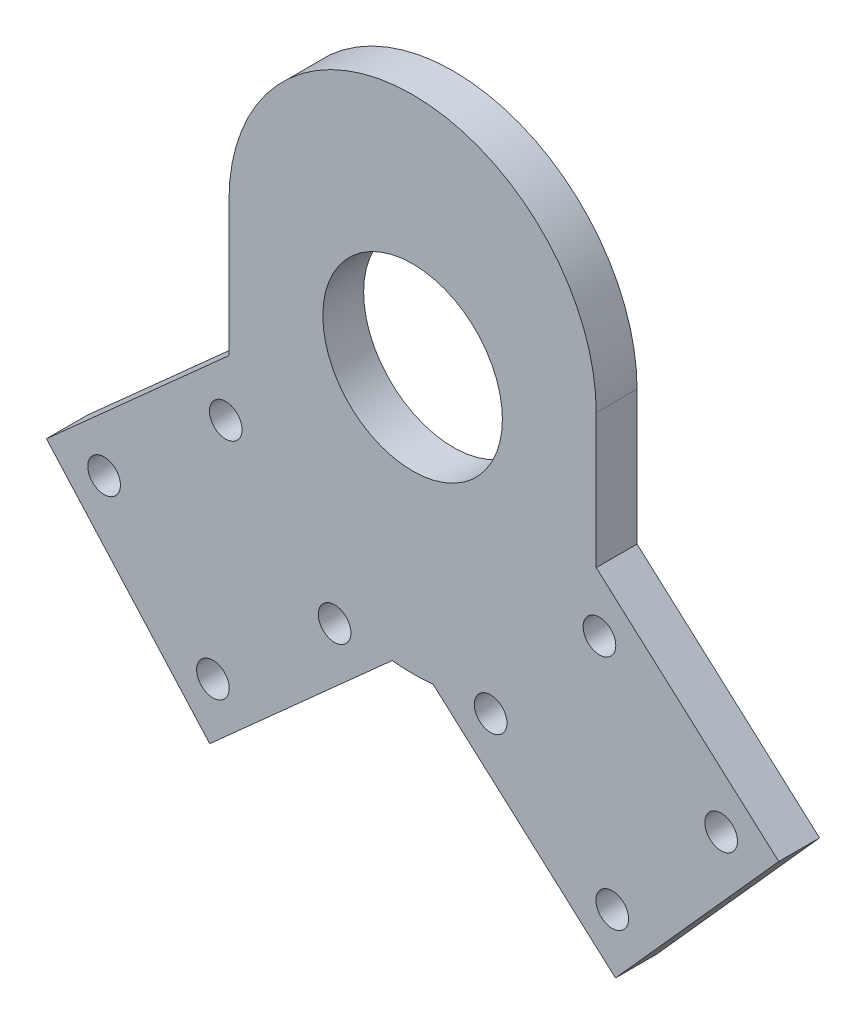
ISO-10303-21;
HEADER;
FILE_DESCRIPTION(('STEP AP214'),'2;1');
FILE_NAME('part.step','',(''),(''),'','','');
FILE_SCHEMA(('AUTOMOTIVE_DESIGN { 1 0 10303 214 1 1 1 1 }'));
ENDSEC;
DATA;
#1=APPLICATION_CONTEXT('core data for automotive mechanical design processes');
#2=APPLICATION_PROTOCOL_DEFINITION('international standard','automotive_design',2000,#1);
#3=PRODUCT_CONTEXT('',#1,'mechanical');
#4=PRODUCT('Part','Part','',(#3));
#5=PRODUCT_RELATED_PRODUCT_CATEGORY('part','',(#4));
#6=PRODUCT_DEFINITION_FORMATION('','',#4);
#7=PRODUCT_DEFINITION_CONTEXT('part definition',#1,'design');
#8=PRODUCT_DEFINITION('design','',#6,#7);
#9=PRODUCT_DEFINITION_SHAPE('','',#8);
#10=(LENGTH_UNIT() NAMED_UNIT(*) SI_UNIT(.MILLI.,.METRE.));
#11=(NAMED_UNIT(*) PLANE_ANGLE_UNIT() SI_UNIT($,.RADIAN.));
#12=(NAMED_UNIT(*) SI_UNIT($,.STERADIAN.) SOLID_ANGLE_UNIT());
#13=UNCERTAINTY_MEASURE_WITH_UNIT(LENGTH_MEASURE(1.E-05),#10,'distance_accuracy_value','');
#14=(GEOMETRIC_REPRESENTATION_CONTEXT(3) GLOBAL_UNCERTAINTY_ASSIGNED_CONTEXT((#13)) GLOBAL_UNIT_ASSIGNED_CONTEXT((#10,
#11,#12)) REPRESENTATION_CONTEXT('',''));
#15=CARTESIAN_POINT('',(0.,0.,0.));
#16=DIRECTION('',(0.,0.,1.));
#17=DIRECTION('',(1.,0.,0.));
#18=AXIS2_PLACEMENT_3D('',#15,#16,#17);
#19=CARTESIAN_POINT('',(-44.8606797749979,-20.,5.));
#20=DIRECTION('',(0.74535599249993,0.666666666666667,0.));
#21=DIRECTION('',(-0.666666666666667,0.74535599249993,0.));
#22=AXIS2_PLACEMENT_3D('',#19,#20,#21);
#23=PLANE('',#22);
#24=DIRECTION('',(0.666666666666667,-0.74535599249993,0.));
#25=VECTOR('',#24,1.);
#26=CARTESIAN_POINT('',(-44.8606797749979,-20.,0.));
#27=LINE('',#26,#25);
#28=CARTESIAN_POINT('',(-44.8606797749979,-20.,0.));
#29=VERTEX_POINT('',#28);
#30=CARTESIAN_POINT('',(-24.8606797749979,-42.3606797749979,0.));
#31=VERTEX_POINT('',#30);
#32=EDGE_CURVE('E266',#29,#31,#27,.T.);
#33=ORIENTED_EDGE('',*,*,#32,.T.);
#34=DIRECTION('',(0.,0.,-1.));
#35=VECTOR('',#34,1.);
#36=CARTESIAN_POINT('',(-24.8606797749979,-42.3606797749979,5.));
#37=LINE('',#36,#35);
#38=CARTESIAN_POINT('',(-24.8606797749979,-42.3606797749979,5.));
#39=VERTEX_POINT('',#38);
#40=EDGE_CURVE('E286',#39,#31,#37,.T.);
#41=ORIENTED_EDGE('',*,*,#40,.F.);
#42=DIRECTION('',(0.666666666666667,-0.74535599249993,0.));
#43=VECTOR('',#42,1.);
#44=CARTESIAN_POINT('',(-44.8606797749979,-20.,5.));
#45=LINE('',#44,#43);
#46=CARTESIAN_POINT('',(-44.8606797749979,-20.,5.));
#47=VERTEX_POINT('',#46);
#48=EDGE_CURVE('E275',#47,#39,#45,.T.);
#49=ORIENTED_EDGE('',*,*,#48,.F.);
#50=DIRECTION('',(0.,0.,-1.));
#51=VECTOR('',#50,1.);
#52=CARTESIAN_POINT('',(-44.8606797749979,-20.,5.));
#53=LINE('',#52,#51);
#54=EDGE_CURVE('E283',#47,#29,#53,.T.);
#55=ORIENTED_EDGE('',*,*,#54,.T.);
#56=EDGE_LOOP('',(#33,#41,#49,#55));
#57=FACE_BOUND('',#56,.T.);
#58=ADVANCED_FACE('F141',(#57),#23,.F.);
#59=CARTESIAN_POINT('',(-2.5,-22.3606797749979,5.));
#60=DIRECTION('',(0.666666666666667,-0.74535599249993,0.));
#61=DIRECTION('',(0.74535599249993,0.666666666666667,0.));
#62=AXIS2_PLACEMENT_3D('',#59,#60,#61);
#63=PLANE('',#62);
#64=DIRECTION('',(-0.74535599249993,-0.666666666666667,0.));
#65=VECTOR('',#64,1.);
#66=CARTESIAN_POINT('',(-2.5,-22.3606797749979,0.));
#67=LINE('',#66,#65);
#68=CARTESIAN_POINT('',(-2.5,-22.3606797749979,0.));
#69=VERTEX_POINT('',#68);
#70=EDGE_CURVE('E277',#69,#31,#67,.T.);
#71=ORIENTED_EDGE('',*,*,#70,.F.);
#72=DIRECTION('',(0.,0.,-1.));
#73=VECTOR('',#72,1.);
#74=CARTESIAN_POINT('',(-2.5,-22.3606797749979,5.));
#75=LINE('',#74,#73);
#76=CARTESIAN_POINT('',(-2.5,-22.3606797749979,5.));
#77=VERTEX_POINT('',#76);
#78=EDGE_CURVE('E12',#77,#69,#75,.T.);
#79=ORIENTED_EDGE('',*,*,#78,.F.);
#80=DIRECTION('',(-0.74535599249993,-0.666666666666667,0.));
#81=VECTOR('',#80,1.);
#82=CARTESIAN_POINT('',(-2.5,-22.3606797749979,5.));
#83=LINE('',#82,#81);
#84=EDGE_CURVE('E271',#77,#39,#83,.T.);
#85=ORIENTED_EDGE('',*,*,#84,.T.);
#86=ORIENTED_EDGE('',*,*,#40,.T.);
#87=EDGE_LOOP('',(#71,#79,#85,#86));
#88=FACE_BOUND('',#87,.T.);
#89=ADVANCED_FACE('F359',(#88),#63,.T.);
#90=CARTESIAN_POINT('',(-22.5,0.,5.));
#91=DIRECTION('',(0.666666666666667,-0.74535599249993,0.));
#92=DIRECTION('',(0.74535599249993,0.666666666666667,0.));
#93=AXIS2_PLACEMENT_3D('',#90,#91,#92);
#94=PLANE('',#93);
#95=DIRECTION('',(-0.74535599249993,-0.666666666666667,0.));
#96=VECTOR('',#95,1.);
#97=CARTESIAN_POINT('',(-22.5,0.,0.));
#98=LINE('',#97,#96);
#99=CARTESIAN_POINT('',(-22.5,0.,0.));
#100=VERTEX_POINT('',#99);
#101=EDGE_CURVE('E262',#100,#29,#98,.T.);
#102=ORIENTED_EDGE('',*,*,#101,.T.);
#103=ORIENTED_EDGE('',*,*,#54,.F.);
#104=DIRECTION('',(-0.74535599249993,-0.666666666666667,0.));
#105=VECTOR('',#104,1.);
#106=CARTESIAN_POINT('',(-22.5,0.,5.));
#107=LINE('',#106,#105);
#108=CARTESIAN_POINT('',(-22.5,0.,5.));
#109=VERTEX_POINT('',#108);
#110=EDGE_CURVE('E289',#109,#47,#107,.T.);
#111=ORIENTED_EDGE('',*,*,#110,.F.);
#112=DIRECTION('',(0.,0.,-1.));
#113=VECTOR('',#112,1.);
#114=CARTESIAN_POINT('',(-22.5,0.,5.));
#115=LINE('',#114,#113);
#116=EDGE_CURVE('E152',#109,#100,#115,.T.);
#117=ORIENTED_EDGE('',*,*,#116,.T.);
#118=EDGE_LOOP('',(#102,#103,#111,#117));
#119=FACE_BOUND('',#118,.T.);
#120=ADVANCED_FACE('F365',(#119),#94,.F.);
#121=CARTESIAN_POINT('',(0.,0.,0.));
#122=DIRECTION('',(0.,0.,1.));
#123=DIRECTION('',(1.,0.,0.));
#124=AXIS2_PLACEMENT_3D('',#121,#122,#123);
#125=PLANE('',#124);
#126=CARTESIAN_POINT('',(0.,10.,0.));
#127=DIRECTION('',(0.,0.,-1.));
#128=DIRECTION('',(-1.,0.,0.));
#129=AXIS2_PLACEMENT_3D('',#126,#127,#128);
#130=CIRCLE('',#129,11.);
#131=CARTESIAN_POINT('',(-11.,10.,0.));
#132=VERTEX_POINT('',#131);
#133=EDGE_CURVE('E539',#132,#132,#130,.T.);
#134=ORIENTED_EDGE('',*,*,#133,.F.);
#135=EDGE_LOOP('',(#134));
#136=FACE_BOUND('',#135,.T.);
#137=CARTESIAN_POINT('',(-24.4672331458316,-35.3005664791649,0.));
#138=DIRECTION('',(0.,0.,1.));
#139=DIRECTION('',(1.,0.,0.));
#140=AXIS2_PLACEMENT_3D('',#137,#138,#139);
#141=CIRCLE('',#140,2.);
#142=CARTESIAN_POINT('',(-22.4672331458316,-35.3005664791649,0.));
#143=VERTEX_POINT('',#142);
#144=EDGE_CURVE('E594',#143,#143,#141,.T.);
#145=ORIENTED_EDGE('',*,*,#144,.T.);
#146=EDGE_LOOP('',(#145));
#147=FACE_BOUND('',#146,.T.);
#148=CARTESIAN_POINT('',(-37.8005664791649,-20.3934466291663,0.));
#149=DIRECTION('',(0.,0.,1.));
#150=DIRECTION('',(1.,0.,0.));
#151=AXIS2_PLACEMENT_3D('',#148,#149,#150);
#152=CIRCLE('',#151,2.);
#153=CARTESIAN_POINT('',(-35.8005664791649,-20.3934466291663,0.));
#154=VERTEX_POINT('',#153);
#155=EDGE_CURVE('E586',#154,#154,#152,.T.);
#156=ORIENTED_EDGE('',*,*,#155,.T.);
#157=EDGE_LOOP('',(#156));
#158=FACE_BOUND('',#157,.T.);
#159=CARTESIAN_POINT('',(-22.8934466291663,-7.06011329583298,0.));
#160=DIRECTION('',(0.,0.,1.));
#161=DIRECTION('',(1.,0.,0.));
#162=AXIS2_PLACEMENT_3D('',#159,#160,#161);
#163=CIRCLE('',#162,2.);
#164=CARTESIAN_POINT('',(-20.8934466291663,-7.06011329583298,0.));
#165=VERTEX_POINT('',#164);
#166=EDGE_CURVE('E578',#165,#165,#163,.T.);
#167=ORIENTED_EDGE('',*,*,#166,.T.);
#168=EDGE_LOOP('',(#167));
#169=FACE_BOUND('',#168,.T.);
#170=CARTESIAN_POINT('',(-9.56011329583299,-21.9672331458316,0.));
#171=DIRECTION('',(0.,0.,1.));
#172=DIRECTION('',(1.,0.,0.));
#173=AXIS2_PLACEMENT_3D('',#170,#171,#172);
#174=CIRCLE('',#173,2.);
#175=CARTESIAN_POINT('',(-7.56011329583299,-21.9672331458316,0.));
#176=VERTEX_POINT('',#175);
#177=EDGE_CURVE('E570',#176,#176,#174,.T.);
#178=ORIENTED_EDGE('',*,*,#177,.T.);
#179=EDGE_LOOP('',(#178));
#180=FACE_BOUND('',#179,.T.);
#181=CARTESIAN_POINT('',(9.56011329583297,-21.9672331458316,0.));
#182=DIRECTION('',(0.,0.,1.));
#183=DIRECTION('',(1.,0.,0.));
#184=AXIS2_PLACEMENT_3D('',#181,#182,#183);
#185=CIRCLE('',#184,2.);
#186=CARTESIAN_POINT('',(11.560113295833,-21.9672331458316,0.));
#187=VERTEX_POINT('',#186);
#188=EDGE_CURVE('E562',#187,#187,#185,.T.);
#189=ORIENTED_EDGE('',*,*,#188,.T.);
#190=EDGE_LOOP('',(#189));
#191=FACE_BOUND('',#190,.T.);
#192=CARTESIAN_POINT('',(24.4672331458316,-35.3005664791649,0.));
#193=DIRECTION('',(0.,0.,1.));
#194=DIRECTION('',(1.,0.,0.));
#195=AXIS2_PLACEMENT_3D('',#192,#193,#194);
#196=CIRCLE('',#195,2.);
#197=CARTESIAN_POINT('',(26.4672331458316,-35.3005664791649,0.));
#198=VERTEX_POINT('',#197);
#199=EDGE_CURVE('E554',#198,#198,#196,.T.);
#200=ORIENTED_EDGE('',*,*,#199,.T.);
#201=EDGE_LOOP('',(#200));
#202=FACE_BOUND('',#201,.T.);
#203=CARTESIAN_POINT('',(37.8005664791649,-20.3934466291663,0.));
#204=DIRECTION('',(0.,0.,1.));
#205=DIRECTION('',(1.,0.,0.));
#206=AXIS2_PLACEMENT_3D('',#203,#204,#205);
#207=CIRCLE('',#206,2.);
#208=CARTESIAN_POINT('',(39.8005664791649,-20.3934466291663,0.));
#209=VERTEX_POINT('',#208);
#210=EDGE_CURVE('E545',#209,#209,#207,.T.);
#211=ORIENTED_EDGE('',*,*,#210,.T.);
#212=EDGE_LOOP('',(#211));
#213=FACE_BOUND('',#212,.T.);
#214=CARTESIAN_POINT('',(22.8934466291663,-7.06011329583298,0.));
#215=DIRECTION('',(0.,0.,1.));
#216=DIRECTION('',(1.,0.,0.));
#217=AXIS2_PLACEMENT_3D('',#214,#215,#216);
#218=CIRCLE('',#217,2.);
#219=CARTESIAN_POINT('',(24.8934466291663,-7.06011329583298,0.));
#220=VERTEX_POINT('',#219);
#221=EDGE_CURVE('E549',#220,#220,#218,.T.);
#222=ORIENTED_EDGE('',*,*,#221,.T.);
#223=EDGE_LOOP('',(#222));
#224=FACE_BOUND('',#223,.T.);
#225=CARTESIAN_POINT('',(0.,16.4440290583573,0.));
#226=DIRECTION('',(0.,0.,1.));
#227=DIRECTION('',(1.,0.,0.));
#228=AXIS2_PLACEMENT_3D('',#225,#226,#227);
#229=CIRCLE('',#228,22.5);
#230=CARTESIAN_POINT('',(22.5,16.4440290583573,0.));
#231=VERTEX_POINT('',#230);
#232=CARTESIAN_POINT('',(-22.5,16.4440290583573,0.));
#233=VERTEX_POINT('',#232);
#234=EDGE_CURVE('E224',#231,#233,#229,.T.);
#235=ORIENTED_EDGE('',*,*,#234,.F.);
#236=DIRECTION('',(0.,-1.,0.));
#237=VECTOR('',#236,1.);
#238=CARTESIAN_POINT('',(22.5,16.4440290583573,0.));
#239=LINE('',#238,#237);
#240=CARTESIAN_POINT('',(22.5,0.,0.));
#241=VERTEX_POINT('',#240);
#242=EDGE_CURVE('E254',#231,#241,#239,.T.);
#243=ORIENTED_EDGE('',*,*,#242,.T.);
#244=DIRECTION('',(0.74535599249993,-0.666666666666667,0.));
#245=VECTOR('',#244,1.);
#246=CARTESIAN_POINT('',(22.5,0.,0.));
#247=LINE('',#246,#245);
#248=CARTESIAN_POINT('',(44.8606797749979,-20.,0.));
#249=VERTEX_POINT('',#248);
#250=EDGE_CURVE('E302',#241,#249,#247,.T.);
#251=ORIENTED_EDGE('',*,*,#250,.T.);
#252=DIRECTION('',(0.666666666666667,0.74535599249993,0.));
#253=VECTOR('',#252,1.);
#254=CARTESIAN_POINT('',(24.8606797749979,-42.3606797749979,0.));
#255=LINE('',#254,#253);
#256=CARTESIAN_POINT('',(24.8606797749979,-42.3606797749979,0.));
#257=VERTEX_POINT('',#256);
#258=EDGE_CURVE('E306',#257,#249,#255,.T.);
#259=ORIENTED_EDGE('',*,*,#258,.F.);
#260=DIRECTION('',(0.74535599249993,-0.666666666666667,0.));
#261=VECTOR('',#260,1.);
#262=CARTESIAN_POINT('',(2.49999999999999,-22.3606797749979,0.));
#263=LINE('',#262,#261);
#264=CARTESIAN_POINT('',(2.49999999999999,-22.3606797749979,0.));
#265=VERTEX_POINT('',#264);
#266=EDGE_CURVE('E295',#265,#257,#263,.T.);
#267=ORIENTED_EDGE('',*,*,#266,.F.);
#268=CARTESIAN_POINT('',(0.,0.,0.));
#269=DIRECTION('',(0.,0.,1.));
#270=DIRECTION('',(1.,0.,0.));
#271=AXIS2_PLACEMENT_3D('',#268,#269,#270);
#272=CIRCLE('',#271,22.5);
#273=EDGE_CURVE('E246',#69,#265,#272,.T.);
#274=ORIENTED_EDGE('',*,*,#273,.F.);
#275=ORIENTED_EDGE('',*,*,#70,.T.);
#276=ORIENTED_EDGE('',*,*,#32,.F.);
#277=ORIENTED_EDGE('',*,*,#101,.F.);
#278=DIRECTION('',(0.,-1.,0.));
#279=VECTOR('',#278,1.);
#280=CARTESIAN_POINT('',(-22.5,16.4440290583573,0.));
#281=LINE('',#280,#279);
#282=EDGE_CURVE('E252',#233,#100,#281,.T.);
#283=ORIENTED_EDGE('',*,*,#282,.F.);
#284=EDGE_LOOP('',(#235,#243,#251,#259,#267,#274,#275,#276,#277,#283));
#285=FACE_BOUND('',#284,.T.);
#286=ADVANCED_FACE('F263',(#136,#147,#158,#169,#180,#191,#202,#213,#224,#285),#125,.F.);
#287=CARTESIAN_POINT('',(0.,0.,5.));
#288=DIRECTION('',(0.,0.,1.));
#289=DIRECTION('',(1.,0.,0.));
#290=AXIS2_PLACEMENT_3D('',#287,#288,#289);
#291=PLANE('',#290);
#292=CARTESIAN_POINT('',(0.,10.,5.));
#293=DIRECTION('',(0.,0.,1.));
#294=DIRECTION('',(1.,0.,0.));
#295=AXIS2_PLACEMENT_3D('',#292,#293,#294);
#296=CIRCLE('',#295,11.);
#297=CARTESIAN_POINT('',(11.,10.,5.));
#298=VERTEX_POINT('',#297);
#299=EDGE_CURVE('E145',#298,#298,#296,.T.);
#300=ORIENTED_EDGE('',*,*,#299,.F.);
#301=EDGE_LOOP('',(#300));
#302=FACE_BOUND('',#301,.T.);
#303=CARTESIAN_POINT('',(-24.4672331458316,-35.3005664791649,5.));
#304=DIRECTION('',(0.,0.,1.));
#305=DIRECTION('',(1.,0.,0.));
#306=AXIS2_PLACEMENT_3D('',#303,#304,#305);
#307=CIRCLE('',#306,2.);
#308=CARTESIAN_POINT('',(-22.4672331458316,-35.3005664791649,5.));
#309=VERTEX_POINT('',#308);
#310=EDGE_CURVE('E543',#309,#309,#307,.T.);
#311=ORIENTED_EDGE('',*,*,#310,.F.);
#312=EDGE_LOOP('',(#311));
#313=FACE_BOUND('',#312,.T.);
#314=CARTESIAN_POINT('',(-37.8005664791649,-20.3934466291663,5.));
#315=DIRECTION('',(0.,0.,1.));
#316=DIRECTION('',(1.,0.,0.));
#317=AXIS2_PLACEMENT_3D('',#314,#315,#316);
#318=CIRCLE('',#317,2.);
#319=CARTESIAN_POINT('',(-35.8005664791649,-20.3934466291663,5.));
#320=VERTEX_POINT('',#319);
#321=EDGE_CURVE('E590',#320,#320,#318,.T.);
#322=ORIENTED_EDGE('',*,*,#321,.F.);
#323=EDGE_LOOP('',(#322));
#324=FACE_BOUND('',#323,.T.);
#325=CARTESIAN_POINT('',(-22.8934466291663,-7.06011329583298,5.));
#326=DIRECTION('',(0.,0.,1.));
#327=DIRECTION('',(1.,0.,0.));
#328=AXIS2_PLACEMENT_3D('',#325,#326,#327);
#329=CIRCLE('',#328,2.);
#330=CARTESIAN_POINT('',(-20.8934466291663,-7.06011329583298,5.));
#331=VERTEX_POINT('',#330);
#332=EDGE_CURVE('E582',#331,#331,#329,.T.);
#333=ORIENTED_EDGE('',*,*,#332,.F.);
#334=EDGE_LOOP('',(#333));
#335=FACE_BOUND('',#334,.T.);
#336=CARTESIAN_POINT('',(-9.56011329583299,-21.9672331458316,5.));
#337=DIRECTION('',(0.,0.,1.));
#338=DIRECTION('',(1.,0.,0.));
#339=AXIS2_PLACEMENT_3D('',#336,#337,#338);
#340=CIRCLE('',#339,2.);
#341=CARTESIAN_POINT('',(-7.56011329583299,-21.9672331458316,5.));
#342=VERTEX_POINT('',#341);
#343=EDGE_CURVE('E574',#342,#342,#340,.T.);
#344=ORIENTED_EDGE('',*,*,#343,.F.);
#345=EDGE_LOOP('',(#344));
#346=FACE_BOUND('',#345,.T.);
#347=CARTESIAN_POINT('',(9.56011329583297,-21.9672331458316,5.));
#348=DIRECTION('',(0.,0.,1.));
#349=DIRECTION('',(1.,0.,0.));
#350=AXIS2_PLACEMENT_3D('',#347,#348,#349);
#351=CIRCLE('',#350,2.);
#352=CARTESIAN_POINT('',(11.560113295833,-21.9672331458316,5.));
#353=VERTEX_POINT('',#352);
#354=EDGE_CURVE('E566',#353,#353,#351,.T.);
#355=ORIENTED_EDGE('',*,*,#354,.F.);
#356=EDGE_LOOP('',(#355));
#357=FACE_BOUND('',#356,.T.);
#358=CARTESIAN_POINT('',(24.4672331458316,-35.3005664791649,5.));
#359=DIRECTION('',(0.,0.,1.));
#360=DIRECTION('',(1.,0.,0.));
#361=AXIS2_PLACEMENT_3D('',#358,#359,#360);
#362=CIRCLE('',#361,2.);
#363=CARTESIAN_POINT('',(26.4672331458316,-35.3005664791649,5.));
#364=VERTEX_POINT('',#363);
#365=EDGE_CURVE('E558',#364,#364,#362,.T.);
#366=ORIENTED_EDGE('',*,*,#365,.F.);
#367=EDGE_LOOP('',(#366));
#368=FACE_BOUND('',#367,.T.);
#369=CARTESIAN_POINT('',(37.8005664791649,-20.3934466291663,5.));
#370=DIRECTION('',(0.,0.,1.));
#371=DIRECTION('',(1.,0.,0.));
#372=AXIS2_PLACEMENT_3D('',#369,#370,#371);
#373=CIRCLE('',#372,2.);
#374=CARTESIAN_POINT('',(39.8005664791649,-20.3934466291663,5.));
#375=VERTEX_POINT('',#374);
#376=EDGE_CURVE('E550',#375,#375,#373,.T.);
#377=ORIENTED_EDGE('',*,*,#376,.F.);
#378=EDGE_LOOP('',(#377));
#379=FACE_BOUND('',#378,.T.);
#380=CARTESIAN_POINT('',(22.8934466291663,-7.06011329583298,5.));
#381=DIRECTION('',(0.,0.,1.));
#382=DIRECTION('',(1.,0.,0.));
#383=AXIS2_PLACEMENT_3D('',#380,#381,#382);
#384=CIRCLE('',#383,2.);
#385=CARTESIAN_POINT('',(24.8934466291663,-7.06011329583298,5.));
#386=VERTEX_POINT('',#385);
#387=EDGE_CURVE('E257',#386,#386,#384,.T.);
#388=ORIENTED_EDGE('',*,*,#387,.F.);
#389=EDGE_LOOP('',(#388));
#390=FACE_BOUND('',#389,.T.);
#391=DIRECTION('',(0.,-1.,0.));
#392=VECTOR('',#391,1.);
#393=CARTESIAN_POINT('',(22.5,16.4440290583573,5.));
#394=LINE('',#393,#392);
#395=CARTESIAN_POINT('',(22.5,16.4440290583573,5.));
#396=VERTEX_POINT('',#395);
#397=CARTESIAN_POINT('',(22.5,0.,5.));
#398=VERTEX_POINT('',#397);
#399=EDGE_CURVE('E237',#396,#398,#394,.T.);
#400=ORIENTED_EDGE('',*,*,#399,.F.);
#401=CARTESIAN_POINT('',(0.,16.4440290583573,5.));
#402=DIRECTION('',(0.,0.,1.));
#403=DIRECTION('',(1.,0.,0.));
#404=AXIS2_PLACEMENT_3D('',#401,#402,#403);
#405=CIRCLE('',#404,22.5);
#406=CARTESIAN_POINT('',(-22.5,16.4440290583573,5.));
#407=VERTEX_POINT('',#406);
#408=EDGE_CURVE('E222',#396,#407,#405,.T.);
#409=ORIENTED_EDGE('',*,*,#408,.T.);
#410=DIRECTION('',(0.,-1.,0.));
#411=VECTOR('',#410,1.);
#412=CARTESIAN_POINT('',(-22.5,16.4440290583573,5.));
#413=LINE('',#412,#411);
#414=EDGE_CURVE('E231',#407,#109,#413,.T.);
#415=ORIENTED_EDGE('',*,*,#414,.T.);
#416=ORIENTED_EDGE('',*,*,#110,.T.);
#417=ORIENTED_EDGE('',*,*,#48,.T.);
#418=ORIENTED_EDGE('',*,*,#84,.F.);
#419=CARTESIAN_POINT('',(0.,0.,5.));
#420=DIRECTION('',(0.,0.,1.));
#421=DIRECTION('',(1.,0.,0.));
#422=AXIS2_PLACEMENT_3D('',#419,#420,#421);
#423=CIRCLE('',#422,22.5);
#424=CARTESIAN_POINT('',(2.49999999999999,-22.3606797749979,5.));
#425=VERTEX_POINT('',#424);
#426=EDGE_CURVE('E307',#77,#425,#423,.T.);
#427=ORIENTED_EDGE('',*,*,#426,.T.);
#428=DIRECTION('',(0.74535599249993,-0.666666666666667,0.));
#429=VECTOR('',#428,1.);
#430=CARTESIAN_POINT('',(2.49999999999999,-22.3606797749979,5.));
#431=LINE('',#430,#429);
#432=CARTESIAN_POINT('',(24.8606797749979,-42.3606797749979,5.));
#433=VERTEX_POINT('',#432);
#434=EDGE_CURVE('E298',#425,#433,#431,.T.);
#435=ORIENTED_EDGE('',*,*,#434,.T.);
#436=DIRECTION('',(0.666666666666667,0.74535599249993,0.));
#437=VECTOR('',#436,1.);
#438=CARTESIAN_POINT('',(24.8606797749979,-42.3606797749979,5.));
#439=LINE('',#438,#437);
#440=CARTESIAN_POINT('',(44.8606797749979,-20.,5.));
#441=VERTEX_POINT('',#440);
#442=EDGE_CURVE('E294',#433,#441,#439,.T.);
#443=ORIENTED_EDGE('',*,*,#442,.T.);
#444=DIRECTION('',(0.74535599249993,-0.666666666666667,0.));
#445=VECTOR('',#444,1.);
#446=CARTESIAN_POINT('',(22.5,0.,5.));
#447=LINE('',#446,#445);
#448=EDGE_CURVE('E290',#398,#441,#447,.T.);
#449=ORIENTED_EDGE('',*,*,#448,.F.);
#450=EDGE_LOOP('',(#400,#409,#415,#416,#417,#418,#427,#435,#443,#449));
#451=FACE_BOUND('',#450,.T.);
#452=ADVANCED_FACE('F239',(#302,#313,#324,#335,#346,#357,#368,#379,#390,#451),#291,.T.);
#453=CARTESIAN_POINT('',(22.5,0.,5.));
#454=DIRECTION('',(0.666666666666667,0.74535599249993,0.));
#455=DIRECTION('',(-0.74535599249993,0.666666666666667,0.));
#456=AXIS2_PLACEMENT_3D('',#453,#454,#455);
#457=PLANE('',#456);
#458=ORIENTED_EDGE('',*,*,#250,.F.);
#459=DIRECTION('',(0.,0.,-1.));
#460=VECTOR('',#459,1.);
#461=CARTESIAN_POINT('',(22.5,0.,5.));
#462=LINE('',#461,#460);
#463=EDGE_CURVE('E313',#398,#241,#462,.T.);
#464=ORIENTED_EDGE('',*,*,#463,.F.);
#465=ORIENTED_EDGE('',*,*,#448,.T.);
#466=DIRECTION('',(0.,0.,-1.));
#467=VECTOR('',#466,1.);
#468=CARTESIAN_POINT('',(44.8606797749979,-20.,5.));
#469=LINE('',#468,#467);
#470=EDGE_CURVE('E301',#441,#249,#469,.T.);
#471=ORIENTED_EDGE('',*,*,#470,.T.);
#472=EDGE_LOOP('',(#458,#464,#465,#471));
#473=FACE_BOUND('',#472,.T.);
#474=ADVANCED_FACE('F344',(#473),#457,.T.);
#475=CARTESIAN_POINT('',(24.8606797749979,-42.3606797749979,5.));
#476=DIRECTION('',(-0.74535599249993,0.666666666666667,0.));
#477=DIRECTION('',(-0.666666666666667,-0.74535599249993,0.));
#478=AXIS2_PLACEMENT_3D('',#475,#476,#477);
#479=PLANE('',#478);
#480=ORIENTED_EDGE('',*,*,#258,.T.);
#481=ORIENTED_EDGE('',*,*,#470,.F.);
#482=ORIENTED_EDGE('',*,*,#442,.F.);
#483=DIRECTION('',(0.,0.,-1.));
#484=VECTOR('',#483,1.);
#485=CARTESIAN_POINT('',(24.8606797749979,-42.3606797749979,5.));
#486=LINE('',#485,#484);
#487=EDGE_CURVE('E320',#433,#257,#486,.T.);
#488=ORIENTED_EDGE('',*,*,#487,.T.);
#489=EDGE_LOOP('',(#480,#481,#482,#488));
#490=FACE_BOUND('',#489,.T.);
#491=ADVANCED_FACE('F341',(#490),#479,.F.);
#492=CARTESIAN_POINT('',(22.5,16.4440290583573,5.));
#493=DIRECTION('',(1.,0.,0.));
#494=DIRECTION('',(0.,0.,-1.));
#495=AXIS2_PLACEMENT_3D('',#492,#493,#494);
#496=PLANE('',#495);
#497=ORIENTED_EDGE('',*,*,#242,.F.);
#498=DIRECTION('',(0.,0.,-1.));
#499=VECTOR('',#498,1.);
#500=CARTESIAN_POINT('',(22.5,16.4440290583573,5.));
#501=LINE('',#500,#499);
#502=EDGE_CURVE('E212',#396,#231,#501,.T.);
#503=ORIENTED_EDGE('',*,*,#502,.F.);
#504=ORIENTED_EDGE('',*,*,#399,.T.);
#505=ORIENTED_EDGE('',*,*,#463,.T.);
#506=EDGE_LOOP('',(#497,#503,#504,#505));
#507=FACE_BOUND('',#506,.T.);
#508=ADVANCED_FACE('F143',(#507),#496,.T.);
#509=CARTESIAN_POINT('',(2.49999999999999,-22.3606797749979,5.));
#510=DIRECTION('',(0.666666666666667,0.74535599249993,0.));
#511=DIRECTION('',(-0.74535599249993,0.666666666666667,0.));
#512=AXIS2_PLACEMENT_3D('',#509,#510,#511);
#513=PLANE('',#512);
#514=ORIENTED_EDGE('',*,*,#266,.T.);
#515=ORIENTED_EDGE('',*,*,#487,.F.);
#516=ORIENTED_EDGE('',*,*,#434,.F.);
#517=DIRECTION('',(0.,0.,-1.));
#518=VECTOR('',#517,1.);
#519=CARTESIAN_POINT('',(2.49999999999999,-22.3606797749979,5.));
#520=LINE('',#519,#518);
#521=EDGE_CURVE('E316',#425,#265,#520,.T.);
#522=ORIENTED_EDGE('',*,*,#521,.T.);
#523=EDGE_LOOP('',(#514,#515,#516,#522));
#524=FACE_BOUND('',#523,.T.);
#525=ADVANCED_FACE('F335',(#524),#513,.F.);
#526=CARTESIAN_POINT('',(0.,0.,5.));
#527=DIRECTION('',(0.,0.,-1.));
#528=DIRECTION('',(-1.,0.,0.));
#529=AXIS2_PLACEMENT_3D('',#526,#527,#528);
#530=CYLINDRICAL_SURFACE('',#529,22.5);
#531=ORIENTED_EDGE('',*,*,#78,.T.);
#532=ORIENTED_EDGE('',*,*,#273,.T.);
#533=ORIENTED_EDGE('',*,*,#521,.F.);
#534=ORIENTED_EDGE('',*,*,#426,.F.);
#535=EDGE_LOOP('',(#531,#532,#533,#534));
#536=FACE_BOUND('',#535,.T.);
#537=ADVANCED_FACE('F331',(#536),#530,.T.);
#538=CARTESIAN_POINT('',(0.,16.4440290583573,5.));
#539=DIRECTION('',(0.,0.,-1.));
#540=DIRECTION('',(-1.,0.,0.));
#541=AXIS2_PLACEMENT_3D('',#538,#539,#540);
#542=CYLINDRICAL_SURFACE('',#541,22.5);
#543=ORIENTED_EDGE('',*,*,#408,.F.);
#544=ORIENTED_EDGE('',*,*,#502,.T.);
#545=ORIENTED_EDGE('',*,*,#234,.T.);
#546=DIRECTION('',(0.,0.,-1.));
#547=VECTOR('',#546,1.);
#548=CARTESIAN_POINT('',(-22.5,16.4440290583573,5.));
#549=LINE('',#548,#547);
#550=EDGE_CURVE('E218',#407,#233,#549,.T.);
#551=ORIENTED_EDGE('',*,*,#550,.F.);
#552=EDGE_LOOP('',(#543,#544,#545,#551));
#553=FACE_BOUND('',#552,.T.);
#554=ADVANCED_FACE('F220',(#553),#542,.T.);
#555=CARTESIAN_POINT('',(-22.5,16.4440290583573,5.));
#556=DIRECTION('',(1.,0.,0.));
#557=DIRECTION('',(0.,0.,-1.));
#558=AXIS2_PLACEMENT_3D('',#555,#556,#557);
#559=PLANE('',#558);
#560=ORIENTED_EDGE('',*,*,#282,.T.);
#561=ORIENTED_EDGE('',*,*,#116,.F.);
#562=ORIENTED_EDGE('',*,*,#414,.F.);
#563=ORIENTED_EDGE('',*,*,#550,.T.);
#564=EDGE_LOOP('',(#560,#561,#562,#563));
#565=FACE_BOUND('',#564,.T.);
#566=ADVANCED_FACE('F232',(#565),#559,.F.);
#567=CARTESIAN_POINT('',(22.8934466291663,-7.06011329583298,5.));
#568=DIRECTION('',(0.,0.,-1.));
#569=DIRECTION('',(-1.,0.,0.));
#570=AXIS2_PLACEMENT_3D('',#567,#568,#569);
#571=CYLINDRICAL_SURFACE('',#570,2.);
#572=ORIENTED_EDGE('',*,*,#387,.T.);
#573=EDGE_LOOP('',(#572));
#574=FACE_BOUND('',#573,.T.);
#575=ORIENTED_EDGE('',*,*,#221,.F.);
#576=EDGE_LOOP('',(#575));
#577=FACE_BOUND('',#576,.T.);
#578=ADVANCED_FACE('F346',(#574,#577),#571,.F.);
#579=CARTESIAN_POINT('',(37.8005664791649,-20.3934466291663,5.));
#580=DIRECTION('',(0.,0.,-1.));
#581=DIRECTION('',(-1.,0.,0.));
#582=AXIS2_PLACEMENT_3D('',#579,#580,#581);
#583=CYLINDRICAL_SURFACE('',#582,2.);
#584=ORIENTED_EDGE('',*,*,#376,.T.);
#585=EDGE_LOOP('',(#584));
#586=FACE_BOUND('',#585,.T.);
#587=ORIENTED_EDGE('',*,*,#210,.F.);
#588=EDGE_LOOP('',(#587));
#589=FACE_BOUND('',#588,.T.);
#590=ADVANCED_FACE('F354',(#586,#589),#583,.F.);
#591=CARTESIAN_POINT('',(24.4672331458316,-35.3005664791649,5.));
#592=DIRECTION('',(0.,0.,-1.));
#593=DIRECTION('',(-1.,0.,0.));
#594=AXIS2_PLACEMENT_3D('',#591,#592,#593);
#595=CYLINDRICAL_SURFACE('',#594,2.);
#596=ORIENTED_EDGE('',*,*,#365,.T.);
#597=EDGE_LOOP('',(#596));
#598=FACE_BOUND('',#597,.T.);
#599=ORIENTED_EDGE('',*,*,#199,.F.);
#600=EDGE_LOOP('',(#599));
#601=FACE_BOUND('',#600,.T.);
#602=ADVANCED_FACE('F396',(#598,#601),#595,.F.);
#603=CARTESIAN_POINT('',(9.56011329583297,-21.9672331458316,5.));
#604=DIRECTION('',(0.,0.,-1.));
#605=DIRECTION('',(-1.,0.,0.));
#606=AXIS2_PLACEMENT_3D('',#603,#604,#605);
#607=CYLINDRICAL_SURFACE('',#606,2.);
#608=ORIENTED_EDGE('',*,*,#354,.T.);
#609=EDGE_LOOP('',(#608));
#610=FACE_BOUND('',#609,.T.);
#611=ORIENTED_EDGE('',*,*,#188,.F.);
#612=EDGE_LOOP('',(#611));
#613=FACE_BOUND('',#612,.T.);
#614=ADVANCED_FACE('F405',(#610,#613),#607,.F.);
#615=CARTESIAN_POINT('',(-9.56011329583299,-21.9672331458316,5.));
#616=DIRECTION('',(0.,0.,-1.));
#617=DIRECTION('',(-1.,0.,0.));
#618=AXIS2_PLACEMENT_3D('',#615,#616,#617);
#619=CYLINDRICAL_SURFACE('',#618,2.);
#620=ORIENTED_EDGE('',*,*,#343,.T.);
#621=EDGE_LOOP('',(#620));
#622=FACE_BOUND('',#621,.T.);
#623=ORIENTED_EDGE('',*,*,#177,.F.);
#624=EDGE_LOOP('',(#623));
#625=FACE_BOUND('',#624,.T.);
#626=ADVANCED_FACE('F414',(#622,#625),#619,.F.);
#627=CARTESIAN_POINT('',(-22.8934466291663,-7.06011329583298,5.));
#628=DIRECTION('',(0.,0.,-1.));
#629=DIRECTION('',(-1.,0.,0.));
#630=AXIS2_PLACEMENT_3D('',#627,#628,#629);
#631=CYLINDRICAL_SURFACE('',#630,2.);
#632=ORIENTED_EDGE('',*,*,#332,.T.);
#633=EDGE_LOOP('',(#632));
#634=FACE_BOUND('',#633,.T.);
#635=ORIENTED_EDGE('',*,*,#166,.F.);
#636=EDGE_LOOP('',(#635));
#637=FACE_BOUND('',#636,.T.);
#638=ADVANCED_FACE('F423',(#634,#637),#631,.F.);
#639=CARTESIAN_POINT('',(-37.8005664791649,-20.3934466291663,5.));
#640=DIRECTION('',(0.,0.,-1.));
#641=DIRECTION('',(-1.,0.,0.));
#642=AXIS2_PLACEMENT_3D('',#639,#640,#641);
#643=CYLINDRICAL_SURFACE('',#642,2.);
#644=ORIENTED_EDGE('',*,*,#321,.T.);
#645=EDGE_LOOP('',(#644));
#646=FACE_BOUND('',#645,.T.);
#647=ORIENTED_EDGE('',*,*,#155,.F.);
#648=EDGE_LOOP('',(#647));
#649=FACE_BOUND('',#648,.T.);
#650=ADVANCED_FACE('F432',(#646,#649),#643,.F.);
#651=CARTESIAN_POINT('',(-24.4672331458316,-35.3005664791649,5.));
#652=DIRECTION('',(0.,0.,-1.));
#653=DIRECTION('',(-1.,0.,0.));
#654=AXIS2_PLACEMENT_3D('',#651,#652,#653);
#655=CYLINDRICAL_SURFACE('',#654,2.);
#656=ORIENTED_EDGE('',*,*,#310,.T.);
#657=EDGE_LOOP('',(#656));
#658=FACE_BOUND('',#657,.T.);
#659=ORIENTED_EDGE('',*,*,#144,.F.);
#660=EDGE_LOOP('',(#659));
#661=FACE_BOUND('',#660,.T.);
#662=ADVANCED_FACE('F441',(#658,#661),#655,.F.);
#663=CARTESIAN_POINT('',(0.,10.,10.));
#664=DIRECTION('',(0.,0.,-1.));
#665=DIRECTION('',(-1.,0.,0.));
#666=AXIS2_PLACEMENT_3D('',#663,#664,#665);
#667=CYLINDRICAL_SURFACE('',#666,11.);
#668=ORIENTED_EDGE('',*,*,#299,.T.);
#669=EDGE_LOOP('',(#668));
#670=FACE_BOUND('',#669,.T.);
#671=ORIENTED_EDGE('',*,*,#133,.T.);
#672=EDGE_LOOP('',(#671));
#673=FACE_BOUND('',#672,.T.);
#674=ADVANCED_FACE('F450',(#670,#673),#667,.F.);
#675=CLOSED_SHELL('',(#58,#89,#120,#286,#452,#474,#491,#508,#525,#537,#554,#566,#578,#590,#602,
#614,#626,#638,#650,#662,#674));
#676=MANIFOLD_SOLID_BREP('B2',#675);
#677=ADVANCED_BREP_SHAPE_REPRESENTATION('',(#18,#676),#14);
#678=SHAPE_DEFINITION_REPRESENTATION(#9,#677);
ENDSEC;
END-ISO-10303-21;
